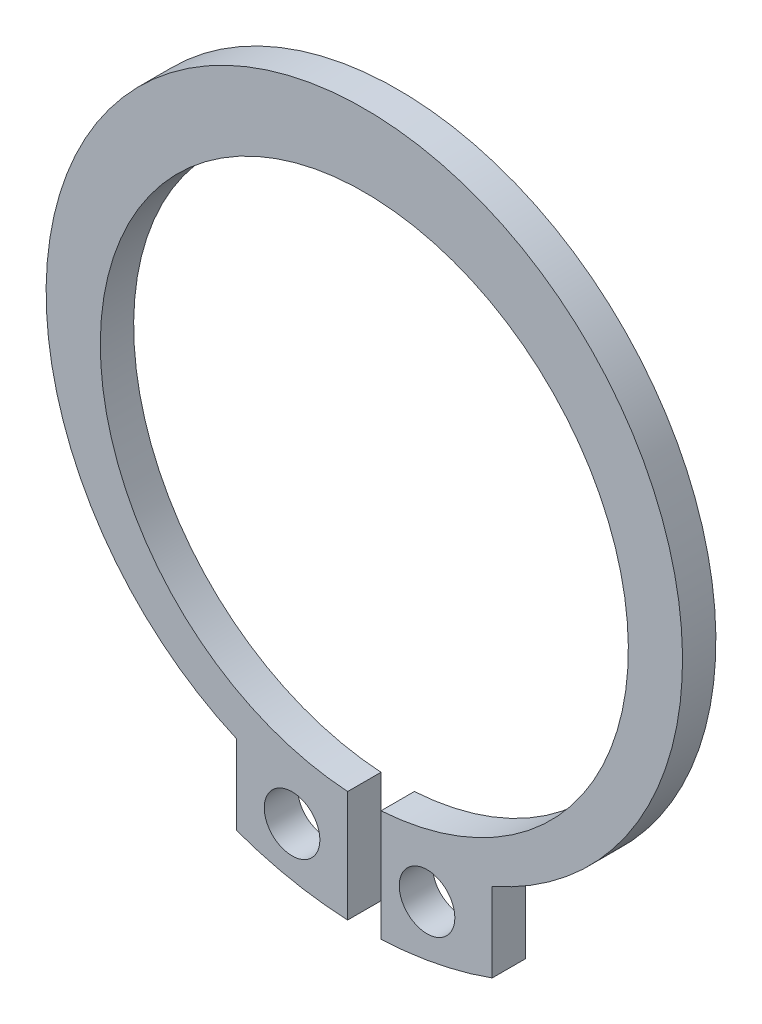
ISO-10303-21;
HEADER;
FILE_DESCRIPTION(('STEP AP214'),'2;1');
FILE_NAME('part.step','',(''),(''),'','','');
FILE_SCHEMA(('AUTOMOTIVE_DESIGN { 1 0 10303 214 1 1 1 1 }'));
ENDSEC;
DATA;
#1=APPLICATION_CONTEXT('core data for automotive mechanical design processes');
#2=APPLICATION_PROTOCOL_DEFINITION('international standard','automotive_design',2000,#1);
#3=PRODUCT_CONTEXT('',#1,'mechanical');
#4=PRODUCT('Part','Part','',(#3));
#5=PRODUCT_RELATED_PRODUCT_CATEGORY('part','',(#4));
#6=PRODUCT_DEFINITION_FORMATION('','',#4);
#7=PRODUCT_DEFINITION_CONTEXT('part definition',#1,'design');
#8=PRODUCT_DEFINITION('design','',#6,#7);
#9=PRODUCT_DEFINITION_SHAPE('','',#8);
#10=(LENGTH_UNIT() NAMED_UNIT(*) SI_UNIT(.MILLI.,.METRE.));
#11=(NAMED_UNIT(*) PLANE_ANGLE_UNIT() SI_UNIT($,.RADIAN.));
#12=(NAMED_UNIT(*) SI_UNIT($,.STERADIAN.) SOLID_ANGLE_UNIT());
#13=UNCERTAINTY_MEASURE_WITH_UNIT(LENGTH_MEASURE(1.E-05),#10,'distance_accuracy_value','');
#14=(GEOMETRIC_REPRESENTATION_CONTEXT(3) GLOBAL_UNCERTAINTY_ASSIGNED_CONTEXT((#13)) GLOBAL_UNIT_ASSIGNED_CONTEXT((#10,
#11,#12)) REPRESENTATION_CONTEXT('',''));
#15=CARTESIAN_POINT('',(0.,0.,0.));
#16=DIRECTION('',(0.,0.,1.));
#17=DIRECTION('',(1.,0.,0.));
#18=AXIS2_PLACEMENT_3D('',#15,#16,#17);
#19=CARTESIAN_POINT('',(0.177777777777778,2.38473772972746,0.));
#20=DIRECTION('',(0.,0.,1.));
#21=DIRECTION('',(1.,0.,0.));
#22=AXIS2_PLACEMENT_3D('',#19,#20,#21);
#23=PLANE('',#22);
#24=CARTESIAN_POINT('',(0.177777777777778,3.99604742986471,0.));
#25=DIRECTION('',(0.,0.,1.));
#26=DIRECTION('',(1.,0.,0.));
#27=AXIS2_PLACEMENT_3D('',#24,#25,#26);
#28=CIRCLE('',#27,9.5);
#29=CARTESIAN_POINT('',(0.777777777777776,-5.4849862690523,0.));
#30=VERTEX_POINT('',#29);
#31=CARTESIAN_POINT('',(-0.422222222222228,-5.4849862690523,0.));
#32=VERTEX_POINT('',#31);
#33=EDGE_CURVE('E10',#30,#32,#28,.T.);
#34=ORIENTED_EDGE('',*,*,#33,.T.);
#35=DIRECTION('',(0.,1.,0.));
#36=VECTOR('',#35,1.);
#37=CARTESIAN_POINT('',(-0.422222222222223,-9.4906126459287,0.));
#38=LINE('',#37,#36);
#39=CARTESIAN_POINT('',(-0.422222222222218,-9.4906126459287,0.));
#40=VERTEX_POINT('',#39);
#41=EDGE_CURVE('E120',#40,#32,#38,.T.);
#42=ORIENTED_EDGE('',*,*,#41,.F.);
#43=CARTESIAN_POINT('',(0.177777777777778,3.99604742986471,0.));
#44=DIRECTION('',(0.,0.,1.));
#45=DIRECTION('',(1.,0.,0.));
#46=AXIS2_PLACEMENT_3D('',#43,#44,#45);
#47=CIRCLE('',#46,13.5);
#48=CARTESIAN_POINT('',(-4.42222222222223,-8.69607611192293,0.));
#49=VERTEX_POINT('',#48);
#50=EDGE_CURVE('E107',#49,#40,#47,.T.);
#51=ORIENTED_EDGE('',*,*,#50,.F.);
#52=DIRECTION('',(0.,1.,0.));
#53=VECTOR('',#52,1.);
#54=CARTESIAN_POINT('',(-4.42222222222223,-8.69607611192293,0.));
#55=LINE('',#54,#53);
#56=CARTESIAN_POINT('',(-4.42222222222223,-5.83929948857341,0.));
#57=VERTEX_POINT('',#56);
#58=EDGE_CURVE('E146',#49,#57,#55,.T.);
#59=ORIENTED_EDGE('',*,*,#58,.T.);
#60=CARTESIAN_POINT('',(0.177777777777778,4.64604742986471,0.));
#61=DIRECTION('',(0.,0.,1.));
#62=DIRECTION('',(1.,0.,0.));
#63=AXIS2_PLACEMENT_3D('',#60,#61,#62);
#64=CIRCLE('',#63,11.45);
#65=CARTESIAN_POINT('',(4.77777777777778,-5.83929948857342,0.));
#66=VERTEX_POINT('',#65);
#67=EDGE_CURVE('E125',#66,#57,#64,.T.);
#68=ORIENTED_EDGE('',*,*,#67,.F.);
#69=DIRECTION('',(0.,1.,0.));
#70=VECTOR('',#69,1.);
#71=CARTESIAN_POINT('',(4.77777777777778,-8.69607611192293,0.));
#72=LINE('',#71,#70);
#73=CARTESIAN_POINT('',(4.77777777777778,-8.69607611192293,0.));
#74=VERTEX_POINT('',#73);
#75=EDGE_CURVE('E163',#74,#66,#72,.T.);
#76=ORIENTED_EDGE('',*,*,#75,.F.);
#77=CARTESIAN_POINT('',(0.177777777777778,3.99604742986471,0.));
#78=DIRECTION('',(0.,0.,1.));
#79=DIRECTION('',(1.,0.,0.));
#80=AXIS2_PLACEMENT_3D('',#77,#78,#79);
#81=CIRCLE('',#80,13.5);
#82=CARTESIAN_POINT('',(0.777777777777776,-9.4906126459287,0.));
#83=VERTEX_POINT('',#82);
#84=EDGE_CURVE('E174',#83,#74,#81,.T.);
#85=ORIENTED_EDGE('',*,*,#84,.F.);
#86=DIRECTION('',(0.,1.,0.));
#87=VECTOR('',#86,1.);
#88=CARTESIAN_POINT('',(0.777777777777776,-9.4906126459287,0.));
#89=LINE('',#88,#87);
#90=EDGE_CURVE('E184',#83,#30,#89,.T.);
#91=ORIENTED_EDGE('',*,*,#90,.T.);
#92=EDGE_LOOP('',(#34,#42,#51,#59,#68,#76,#85,#91));
#93=FACE_BOUND('',#92,.T.);
#94=CARTESIAN_POINT('',(-2.42222222222222,-7.4906126459287,0.));
#95=DIRECTION('',(0.,0.,1.));
#96=DIRECTION('',(1.,0.,0.));
#97=AXIS2_PLACEMENT_3D('',#94,#95,#96);
#98=CIRCLE('',#97,1.);
#99=CARTESIAN_POINT('',(-1.42222222222222,-7.4906126459287,0.));
#100=VERTEX_POINT('',#99);
#101=EDGE_CURVE('E95',#100,#100,#98,.T.);
#102=ORIENTED_EDGE('',*,*,#101,.T.);
#103=EDGE_LOOP('',(#102));
#104=FACE_BOUND('',#103,.T.);
#105=CARTESIAN_POINT('',(2.43492063492063,-7.4906126459287,0.));
#106=DIRECTION('',(0.,0.,1.));
#107=DIRECTION('',(1.,0.,0.));
#108=AXIS2_PLACEMENT_3D('',#105,#106,#107);
#109=CIRCLE('',#108,1.);
#110=CARTESIAN_POINT('',(3.43492063492063,-7.4906126459287,0.));
#111=VERTEX_POINT('',#110);
#112=EDGE_CURVE('E108',#111,#111,#109,.T.);
#113=ORIENTED_EDGE('',*,*,#112,.T.);
#114=EDGE_LOOP('',(#113));
#115=FACE_BOUND('',#114,.T.);
#116=ADVANCED_FACE('F16',(#93,#104,#115),#23,.F.);
#117=CARTESIAN_POINT('',(0.177777777777778,2.38473772972746,1.2));
#118=DIRECTION('',(0.,0.,1.));
#119=DIRECTION('',(1.,0.,0.));
#120=AXIS2_PLACEMENT_3D('',#117,#118,#119);
#121=PLANE('',#120);
#122=DIRECTION('',(0.,-1.,0.));
#123=VECTOR('',#122,1.);
#124=CARTESIAN_POINT('',(-0.422222222222223,-9.4906126459287,1.2));
#125=LINE('',#124,#123);
#126=CARTESIAN_POINT('',(-0.422222222222228,-5.4849862690523,1.2));
#127=VERTEX_POINT('',#126);
#128=CARTESIAN_POINT('',(-0.422222222222218,-9.4906126459287,1.2));
#129=VERTEX_POINT('',#128);
#130=EDGE_CURVE('E94',#127,#129,#125,.T.);
#131=ORIENTED_EDGE('',*,*,#130,.F.);
#132=CARTESIAN_POINT('',(0.177777777777778,3.99604742986471,1.2));
#133=DIRECTION('',(0.,0.,1.));
#134=DIRECTION('',(1.,0.,0.));
#135=AXIS2_PLACEMENT_3D('',#132,#133,#134);
#136=CIRCLE('',#135,9.5);
#137=CARTESIAN_POINT('',(0.777777777777776,-5.4849862690523,1.2));
#138=VERTEX_POINT('',#137);
#139=EDGE_CURVE('E25',#138,#127,#136,.T.);
#140=ORIENTED_EDGE('',*,*,#139,.F.);
#141=DIRECTION('',(0.,1.,0.));
#142=VECTOR('',#141,1.);
#143=CARTESIAN_POINT('',(0.777777777777776,-9.4906126459287,1.2));
#144=LINE('',#143,#142);
#145=CARTESIAN_POINT('',(0.777777777777776,-9.4906126459287,1.2));
#146=VERTEX_POINT('',#145);
#147=EDGE_CURVE('E177',#146,#138,#144,.T.);
#148=ORIENTED_EDGE('',*,*,#147,.F.);
#149=CARTESIAN_POINT('',(0.177777777777778,3.99604742986471,1.2));
#150=DIRECTION('',(0.,0.,-1.));
#151=DIRECTION('',(1.,0.,0.));
#152=AXIS2_PLACEMENT_3D('',#149,#150,#151);
#153=CIRCLE('',#152,13.5);
#154=CARTESIAN_POINT('',(4.77777777777778,-8.69607611192293,1.2));
#155=VERTEX_POINT('',#154);
#156=EDGE_CURVE('E166',#155,#146,#153,.T.);
#157=ORIENTED_EDGE('',*,*,#156,.F.);
#158=DIRECTION('',(0.,-1.,0.));
#159=VECTOR('',#158,1.);
#160=CARTESIAN_POINT('',(4.77777777777778,-8.69607611192293,1.2));
#161=LINE('',#160,#159);
#162=CARTESIAN_POINT('',(4.77777777777778,-5.83929948857342,1.2));
#163=VERTEX_POINT('',#162);
#164=EDGE_CURVE('E155',#163,#155,#161,.T.);
#165=ORIENTED_EDGE('',*,*,#164,.F.);
#166=CARTESIAN_POINT('',(0.177777777777778,4.64604742986471,1.2));
#167=DIRECTION('',(0.,0.,-1.));
#168=DIRECTION('',(1.,0.,0.));
#169=AXIS2_PLACEMENT_3D('',#166,#167,#168);
#170=CIRCLE('',#169,11.45);
#171=CARTESIAN_POINT('',(-4.42222222222223,-5.83929948857341,1.2));
#172=VERTEX_POINT('',#171);
#173=EDGE_CURVE('E126',#172,#163,#170,.T.);
#174=ORIENTED_EDGE('',*,*,#173,.F.);
#175=DIRECTION('',(0.,1.,0.));
#176=VECTOR('',#175,1.);
#177=CARTESIAN_POINT('',(-4.42222222222223,-8.69607611192293,1.2));
#178=LINE('',#177,#176);
#179=CARTESIAN_POINT('',(-4.42222222222223,-8.69607611192293,1.2));
#180=VERTEX_POINT('',#179);
#181=EDGE_CURVE('E111',#180,#172,#178,.T.);
#182=ORIENTED_EDGE('',*,*,#181,.F.);
#183=CARTESIAN_POINT('',(0.177777777777778,3.99604742986471,1.2));
#184=DIRECTION('',(0.,0.,-1.));
#185=DIRECTION('',(1.,0.,0.));
#186=AXIS2_PLACEMENT_3D('',#183,#184,#185);
#187=CIRCLE('',#186,13.5);
#188=EDGE_CURVE('E135',#129,#180,#187,.T.);
#189=ORIENTED_EDGE('',*,*,#188,.F.);
#190=EDGE_LOOP('',(#131,#140,#148,#157,#165,#174,#182,#189));
#191=FACE_BOUND('',#190,.T.);
#192=CARTESIAN_POINT('',(-2.42222222222222,-7.4906126459287,1.2));
#193=DIRECTION('',(0.,0.,-1.));
#194=DIRECTION('',(1.,0.,0.));
#195=AXIS2_PLACEMENT_3D('',#192,#193,#194);
#196=CIRCLE('',#195,1.);
#197=CARTESIAN_POINT('',(-1.42222222222222,-7.4906126459287,1.2));
#198=VERTEX_POINT('',#197);
#199=EDGE_CURVE('E90',#198,#198,#196,.T.);
#200=ORIENTED_EDGE('',*,*,#199,.T.);
#201=EDGE_LOOP('',(#200));
#202=FACE_BOUND('',#201,.T.);
#203=CARTESIAN_POINT('',(2.43492063492063,-7.4906126459287,1.2));
#204=DIRECTION('',(0.,0.,-1.));
#205=DIRECTION('',(1.,0.,0.));
#206=AXIS2_PLACEMENT_3D('',#203,#204,#205);
#207=CIRCLE('',#206,1.);
#208=CARTESIAN_POINT('',(3.43492063492063,-7.4906126459287,1.2));
#209=VERTEX_POINT('',#208);
#210=EDGE_CURVE('E103',#209,#209,#207,.T.);
#211=ORIENTED_EDGE('',*,*,#210,.T.);
#212=EDGE_LOOP('',(#211));
#213=FACE_BOUND('',#212,.T.);
#214=ADVANCED_FACE('F18',(#191,#202,#213),#121,.T.);
#215=CARTESIAN_POINT('',(0.177777777777778,3.99604742986471,0.));
#216=DIRECTION('',(0.,0.,-1.));
#217=DIRECTION('',(1.,0.,0.));
#218=AXIS2_PLACEMENT_3D('',#215,#216,#217);
#219=CYLINDRICAL_SURFACE('',#218,9.5);
#220=ORIENTED_EDGE('',*,*,#139,.T.);
#221=DIRECTION('',(0.,0.,1.));
#222=VECTOR('',#221,1.);
#223=CARTESIAN_POINT('',(-0.422222222222228,-5.4849862690523,0.));
#224=LINE('',#223,#222);
#225=EDGE_CURVE('E131',#32,#127,#224,.T.);
#226=ORIENTED_EDGE('',*,*,#225,.F.);
#227=ORIENTED_EDGE('',*,*,#33,.F.);
#228=DIRECTION('',(0.,0.,1.));
#229=VECTOR('',#228,1.);
#230=CARTESIAN_POINT('',(0.777777777777776,-5.4849862690523,0.));
#231=LINE('',#230,#229);
#232=EDGE_CURVE('E181',#30,#138,#231,.T.);
#233=ORIENTED_EDGE('',*,*,#232,.T.);
#234=EDGE_LOOP('',(#220,#226,#227,#233));
#235=FACE_BOUND('',#234,.T.);
#236=ADVANCED_FACE('F187',(#235),#219,.F.);
#237=CARTESIAN_POINT('',(0.777777777777776,-7.4877994574905,0.));
#238=DIRECTION('',(-1.,0.,0.));
#239=DIRECTION('',(0.,-1.,0.));
#240=AXIS2_PLACEMENT_3D('',#237,#238,#239);
#241=PLANE('',#240);
#242=ORIENTED_EDGE('',*,*,#147,.T.);
#243=ORIENTED_EDGE('',*,*,#232,.F.);
#244=ORIENTED_EDGE('',*,*,#90,.F.);
#245=DIRECTION('',(0.,0.,1.));
#246=VECTOR('',#245,1.);
#247=CARTESIAN_POINT('',(0.777777777777776,-9.4906126459287,0.));
#248=LINE('',#247,#246);
#249=EDGE_CURVE('E170',#83,#146,#248,.T.);
#250=ORIENTED_EDGE('',*,*,#249,.T.);
#251=EDGE_LOOP('',(#242,#243,#244,#250));
#252=FACE_BOUND('',#251,.T.);
#253=ADVANCED_FACE('F204',(#252),#241,.T.);
#254=CARTESIAN_POINT('',(0.177777777777778,3.99604742986471,0.));
#255=DIRECTION('',(0.,0.,-1.));
#256=DIRECTION('',(1.,0.,0.));
#257=AXIS2_PLACEMENT_3D('',#254,#255,#256);
#258=CYLINDRICAL_SURFACE('',#257,13.5);
#259=ORIENTED_EDGE('',*,*,#156,.T.);
#260=ORIENTED_EDGE('',*,*,#249,.F.);
#261=ORIENTED_EDGE('',*,*,#84,.T.);
#262=DIRECTION('',(0.,0.,1.));
#263=VECTOR('',#262,1.);
#264=CARTESIAN_POINT('',(4.77777777777778,-8.69607611192293,0.));
#265=LINE('',#264,#263);
#266=EDGE_CURVE('E159',#74,#155,#265,.T.);
#267=ORIENTED_EDGE('',*,*,#266,.T.);
#268=EDGE_LOOP('',(#259,#260,#261,#267));
#269=FACE_BOUND('',#268,.T.);
#270=ADVANCED_FACE('F207',(#269),#258,.T.);
#271=CARTESIAN_POINT('',(4.77777777777778,-7.26768780024817,0.));
#272=DIRECTION('',(1.,0.,0.));
#273=DIRECTION('',(0.,1.,0.));
#274=AXIS2_PLACEMENT_3D('',#271,#272,#273);
#275=PLANE('',#274);
#276=ORIENTED_EDGE('',*,*,#164,.T.);
#277=ORIENTED_EDGE('',*,*,#266,.F.);
#278=ORIENTED_EDGE('',*,*,#75,.T.);
#279=DIRECTION('',(0.,0.,1.));
#280=VECTOR('',#279,1.);
#281=CARTESIAN_POINT('',(4.77777777777778,-5.83929948857342,0.));
#282=LINE('',#281,#280);
#283=EDGE_CURVE('E122',#66,#163,#282,.T.);
#284=ORIENTED_EDGE('',*,*,#283,.T.);
#285=EDGE_LOOP('',(#276,#277,#278,#284));
#286=FACE_BOUND('',#285,.T.);
#287=ADVANCED_FACE('F209',(#286),#275,.T.);
#288=CARTESIAN_POINT('',(0.177777777777778,4.64604742986471,0.));
#289=DIRECTION('',(0.,0.,-1.));
#290=DIRECTION('',(1.,0.,0.));
#291=AXIS2_PLACEMENT_3D('',#288,#289,#290);
#292=CYLINDRICAL_SURFACE('',#291,11.45);
#293=ORIENTED_EDGE('',*,*,#173,.T.);
#294=ORIENTED_EDGE('',*,*,#283,.F.);
#295=ORIENTED_EDGE('',*,*,#67,.T.);
#296=DIRECTION('',(0.,0.,1.));
#297=VECTOR('',#296,1.);
#298=CARTESIAN_POINT('',(-4.42222222222223,-5.83929948857341,0.));
#299=LINE('',#298,#297);
#300=EDGE_CURVE('E115',#57,#172,#299,.T.);
#301=ORIENTED_EDGE('',*,*,#300,.T.);
#302=EDGE_LOOP('',(#293,#294,#295,#301));
#303=FACE_BOUND('',#302,.T.);
#304=ADVANCED_FACE('F213',(#303),#292,.T.);
#305=CARTESIAN_POINT('',(-4.42222222222223,-7.26768780024817,0.));
#306=DIRECTION('',(-1.,0.,0.));
#307=DIRECTION('',(0.,-1.,0.));
#308=AXIS2_PLACEMENT_3D('',#305,#306,#307);
#309=PLANE('',#308);
#310=ORIENTED_EDGE('',*,*,#181,.T.);
#311=ORIENTED_EDGE('',*,*,#300,.F.);
#312=ORIENTED_EDGE('',*,*,#58,.F.);
#313=DIRECTION('',(0.,0.,1.));
#314=VECTOR('',#313,1.);
#315=CARTESIAN_POINT('',(-4.42222222222223,-8.69607611192293,0.));
#316=LINE('',#315,#314);
#317=EDGE_CURVE('E139',#49,#180,#316,.T.);
#318=ORIENTED_EDGE('',*,*,#317,.T.);
#319=EDGE_LOOP('',(#310,#311,#312,#318));
#320=FACE_BOUND('',#319,.T.);
#321=ADVANCED_FACE('F216',(#320),#309,.T.);
#322=CARTESIAN_POINT('',(0.177777777777778,3.99604742986471,0.));
#323=DIRECTION('',(0.,0.,-1.));
#324=DIRECTION('',(1.,0.,0.));
#325=AXIS2_PLACEMENT_3D('',#322,#323,#324);
#326=CYLINDRICAL_SURFACE('',#325,13.5);
#327=ORIENTED_EDGE('',*,*,#188,.T.);
#328=ORIENTED_EDGE('',*,*,#317,.F.);
#329=ORIENTED_EDGE('',*,*,#50,.T.);
#330=DIRECTION('',(0.,0.,1.));
#331=VECTOR('',#330,1.);
#332=CARTESIAN_POINT('',(-0.422222222222218,-9.4906126459287,0.));
#333=LINE('',#332,#331);
#334=EDGE_CURVE('E101',#40,#129,#333,.T.);
#335=ORIENTED_EDGE('',*,*,#334,.T.);
#336=EDGE_LOOP('',(#327,#328,#329,#335));
#337=FACE_BOUND('',#336,.T.);
#338=ADVANCED_FACE('F195',(#337),#326,.T.);
#339=CARTESIAN_POINT('',(-0.422222222222223,-7.4877994574905,0.));
#340=DIRECTION('',(1.,0.,0.));
#341=DIRECTION('',(0.,1.,0.));
#342=AXIS2_PLACEMENT_3D('',#339,#340,#341);
#343=PLANE('',#342);
#344=ORIENTED_EDGE('',*,*,#130,.T.);
#345=ORIENTED_EDGE('',*,*,#334,.F.);
#346=ORIENTED_EDGE('',*,*,#41,.T.);
#347=ORIENTED_EDGE('',*,*,#225,.T.);
#348=EDGE_LOOP('',(#344,#345,#346,#347));
#349=FACE_BOUND('',#348,.T.);
#350=ADVANCED_FACE('F190',(#349),#343,.T.);
#351=CARTESIAN_POINT('',(-2.42222222222222,-7.4906126459287,0.6));
#352=DIRECTION('',(0.,0.,-1.));
#353=DIRECTION('',(1.,0.,0.));
#354=AXIS2_PLACEMENT_3D('',#351,#352,#353);
#355=CYLINDRICAL_SURFACE('',#354,1.);
#356=ORIENTED_EDGE('',*,*,#199,.F.);
#357=EDGE_LOOP('',(#356));
#358=FACE_BOUND('',#357,.T.);
#359=ORIENTED_EDGE('',*,*,#101,.F.);
#360=EDGE_LOOP('',(#359));
#361=FACE_BOUND('',#360,.T.);
#362=ADVANCED_FACE('F244',(#358,#361),#355,.F.);
#363=CARTESIAN_POINT('',(2.43492063492063,-7.4906126459287,0.6));
#364=DIRECTION('',(0.,0.,-1.));
#365=DIRECTION('',(1.,0.,0.));
#366=AXIS2_PLACEMENT_3D('',#363,#364,#365);
#367=CYLINDRICAL_SURFACE('',#366,1.);
#368=ORIENTED_EDGE('',*,*,#210,.F.);
#369=EDGE_LOOP('',(#368));
#370=FACE_BOUND('',#369,.T.);
#371=ORIENTED_EDGE('',*,*,#112,.F.);
#372=EDGE_LOOP('',(#371));
#373=FACE_BOUND('',#372,.T.);
#374=ADVANCED_FACE('F250',(#370,#373),#367,.F.);
#375=CLOSED_SHELL('',(#116,#214,#236,#253,#270,#287,#304,#321,#338,#350,#362,#374));
#376=MANIFOLD_SOLID_BREP('B1',#375);
#377=ADVANCED_BREP_SHAPE_REPRESENTATION('',(#18,#376),#14);
#378=SHAPE_DEFINITION_REPRESENTATION(#9,#377);
ENDSEC;
END-ISO-10303-21;
